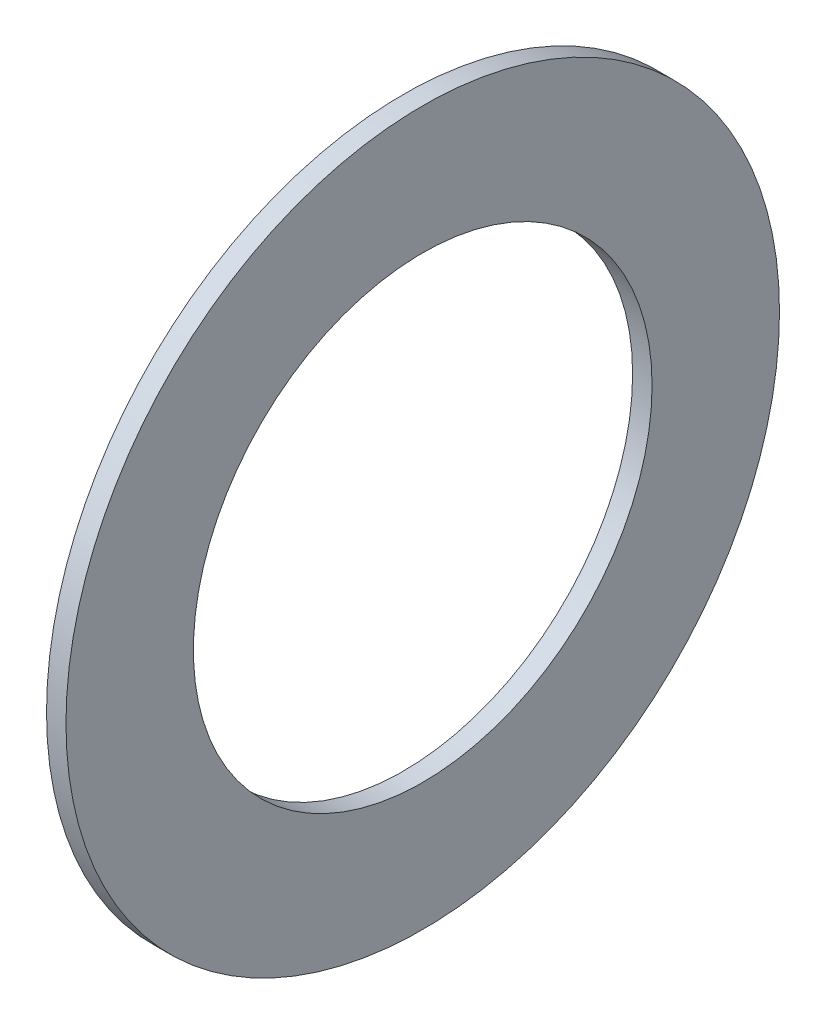
ISO-10303-21;
HEADER;
FILE_DESCRIPTION(('STEP AP214'),'2;1');
FILE_NAME('part.step','',(''),(''),'','','');
FILE_SCHEMA(('AUTOMOTIVE_DESIGN { 1 0 10303 214 1 1 1 1 }'));
ENDSEC;
DATA;
#1=APPLICATION_CONTEXT('core data for automotive mechanical design processes');
#2=APPLICATION_PROTOCOL_DEFINITION('international standard','automotive_design',2000,#1);
#3=PRODUCT_CONTEXT('',#1,'mechanical');
#4=PRODUCT('Part','Part','',(#3));
#5=PRODUCT_RELATED_PRODUCT_CATEGORY('part','',(#4));
#6=PRODUCT_DEFINITION_FORMATION('','',#4);
#7=PRODUCT_DEFINITION_CONTEXT('part definition',#1,'design');
#8=PRODUCT_DEFINITION('design','',#6,#7);
#9=PRODUCT_DEFINITION_SHAPE('','',#8);
#10=(LENGTH_UNIT() NAMED_UNIT(*) SI_UNIT(.MILLI.,.METRE.));
#11=(NAMED_UNIT(*) PLANE_ANGLE_UNIT() SI_UNIT($,.RADIAN.));
#12=(NAMED_UNIT(*) SI_UNIT($,.STERADIAN.) SOLID_ANGLE_UNIT());
#13=UNCERTAINTY_MEASURE_WITH_UNIT(LENGTH_MEASURE(1.E-05),#10,'distance_accuracy_value','');
#14=(GEOMETRIC_REPRESENTATION_CONTEXT(3) GLOBAL_UNCERTAINTY_ASSIGNED_CONTEXT((#13)) GLOBAL_UNIT_ASSIGNED_CONTEXT((#10,
#11,#12)) REPRESENTATION_CONTEXT('',''));
#15=CARTESIAN_POINT('',(0.,0.,0.));
#16=DIRECTION('',(0.,0.,1.));
#17=DIRECTION('',(1.,0.,0.));
#18=AXIS2_PLACEMENT_3D('',#15,#16,#17);
#19=CARTESIAN_POINT('',(2.14728,2.1,0.));
#20=DIRECTION('',(-1.,0.,0.));
#21=DIRECTION('',(0.,0.,1.));
#22=AXIS2_PLACEMENT_3D('',#19,#20,#21);
#23=PLANE('',#22);
#24=CARTESIAN_POINT('',(2.14728,0.,0.));
#25=DIRECTION('',(1.,0.,0.));
#26=DIRECTION('',(0.,0.,-1.));
#27=AXIS2_PLACEMENT_3D('',#24,#25,#26);
#28=CIRCLE('',#27,1.35);
#29=CARTESIAN_POINT('',(2.14728,0.,-1.35));
#30=VERTEX_POINT('',#29);
#31=EDGE_CURVE('E29',#30,#30,#28,.T.);
#32=ORIENTED_EDGE('',*,*,#31,.T.);
#33=EDGE_LOOP('',(#32));
#34=FACE_BOUND('',#33,.T.);
#35=CARTESIAN_POINT('',(2.14728,0.,0.));
#36=DIRECTION('',(1.,0.,0.));
#37=DIRECTION('',(0.,0.,-1.));
#38=AXIS2_PLACEMENT_3D('',#35,#36,#37);
#39=CIRCLE('',#38,2.1);
#40=CARTESIAN_POINT('',(2.14728,0.,-2.1));
#41=VERTEX_POINT('',#40);
#42=EDGE_CURVE('E25',#41,#41,#39,.T.);
#43=ORIENTED_EDGE('',*,*,#42,.F.);
#44=EDGE_LOOP('',(#43));
#45=FACE_BOUND('',#44,.T.);
#46=ADVANCED_FACE('F14',(#34,#45),#23,.T.);
#47=CARTESIAN_POINT('',(2.26182,0.,0.));
#48=DIRECTION('',(1.,0.,0.));
#49=DIRECTION('',(0.,0.,-1.));
#50=AXIS2_PLACEMENT_3D('',#47,#48,#49);
#51=CYLINDRICAL_SURFACE('',#50,1.35);
#52=CARTESIAN_POINT('',(2.26182,0.,0.));
#53=DIRECTION('',(1.,0.,0.));
#54=DIRECTION('',(0.,0.,-1.));
#55=AXIS2_PLACEMENT_3D('',#52,#53,#54);
#56=CIRCLE('',#55,1.35);
#57=CARTESIAN_POINT('',(2.26182,0.,-1.35));
#58=VERTEX_POINT('',#57);
#59=EDGE_CURVE('E21',#58,#58,#56,.T.);
#60=ORIENTED_EDGE('',*,*,#59,.T.);
#61=EDGE_LOOP('',(#60));
#62=FACE_BOUND('',#61,.T.);
#63=ORIENTED_EDGE('',*,*,#31,.F.);
#64=EDGE_LOOP('',(#63));
#65=FACE_BOUND('',#64,.T.);
#66=ADVANCED_FACE('F37',(#62,#65),#51,.F.);
#67=CARTESIAN_POINT('',(2.26182,1.35,0.));
#68=DIRECTION('',(1.,0.,0.));
#69=DIRECTION('',(0.,0.,-1.));
#70=AXIS2_PLACEMENT_3D('',#67,#68,#69);
#71=PLANE('',#70);
#72=CARTESIAN_POINT('',(2.26182,0.,0.));
#73=DIRECTION('',(1.,0.,0.));
#74=DIRECTION('',(0.,0.,-1.));
#75=AXIS2_PLACEMENT_3D('',#72,#73,#74);
#76=CIRCLE('',#75,2.1);
#77=CARTESIAN_POINT('',(2.26182,0.,-2.1));
#78=VERTEX_POINT('',#77);
#79=EDGE_CURVE('E9',#78,#78,#76,.T.);
#80=ORIENTED_EDGE('',*,*,#79,.T.);
#81=EDGE_LOOP('',(#80));
#82=FACE_BOUND('',#81,.T.);
#83=ORIENTED_EDGE('',*,*,#59,.F.);
#84=EDGE_LOOP('',(#83));
#85=FACE_BOUND('',#84,.T.);
#86=ADVANCED_FACE('F39',(#82,#85),#71,.T.);
#87=CARTESIAN_POINT('',(2.26182,0.,0.));
#88=DIRECTION('',(1.,0.,0.));
#89=DIRECTION('',(0.,0.,-1.));
#90=AXIS2_PLACEMENT_3D('',#87,#88,#89);
#91=CYLINDRICAL_SURFACE('',#90,2.1);
#92=ORIENTED_EDGE('',*,*,#42,.T.);
#93=EDGE_LOOP('',(#92));
#94=FACE_BOUND('',#93,.T.);
#95=ORIENTED_EDGE('',*,*,#79,.F.);
#96=EDGE_LOOP('',(#95));
#97=FACE_BOUND('',#96,.T.);
#98=ADVANCED_FACE('F16',(#94,#97),#91,.T.);
#99=CLOSED_SHELL('',(#46,#66,#86,#98));
#100=MANIFOLD_SOLID_BREP('B1',#99);
#101=ADVANCED_BREP_SHAPE_REPRESENTATION('',(#18,#100),#14);
#102=SHAPE_DEFINITION_REPRESENTATION(#9,#101);
ENDSEC;
END-ISO-10303-21;
